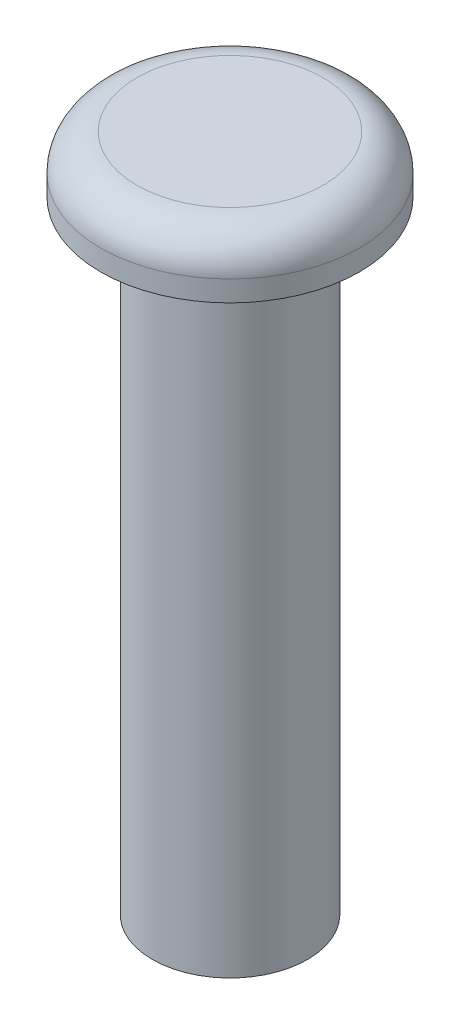
ISO-10303-21;
HEADER;
FILE_DESCRIPTION(('STEP AP214'),'2;1');
FILE_NAME('part.step','',(''),(''),'','','');
FILE_SCHEMA(('AUTOMOTIVE_DESIGN { 1 0 10303 214 1 1 1 1 }'));
ENDSEC;
DATA;
#1=APPLICATION_CONTEXT('core data for automotive mechanical design processes');
#2=APPLICATION_PROTOCOL_DEFINITION('international standard','automotive_design',2000,#1);
#3=PRODUCT_CONTEXT('',#1,'mechanical');
#4=PRODUCT('Part','Part','',(#3));
#5=PRODUCT_RELATED_PRODUCT_CATEGORY('part','',(#4));
#6=PRODUCT_DEFINITION_FORMATION('','',#4);
#7=PRODUCT_DEFINITION_CONTEXT('part definition',#1,'design');
#8=PRODUCT_DEFINITION('design','',#6,#7);
#9=PRODUCT_DEFINITION_SHAPE('','',#8);
#10=(LENGTH_UNIT() NAMED_UNIT(*) SI_UNIT(.MILLI.,.METRE.));
#11=(NAMED_UNIT(*) PLANE_ANGLE_UNIT() SI_UNIT($,.RADIAN.));
#12=(NAMED_UNIT(*) SI_UNIT($,.STERADIAN.) SOLID_ANGLE_UNIT());
#13=UNCERTAINTY_MEASURE_WITH_UNIT(LENGTH_MEASURE(1.E-05),#10,'distance_accuracy_value','');
#14=(GEOMETRIC_REPRESENTATION_CONTEXT(3) GLOBAL_UNCERTAINTY_ASSIGNED_CONTEXT((#13)) GLOBAL_UNIT_ASSIGNED_CONTEXT((#10,
#11,#12)) REPRESENTATION_CONTEXT('',''));
#15=CARTESIAN_POINT('',(0.,0.,0.));
#16=DIRECTION('',(0.,0.,1.));
#17=DIRECTION('',(1.,0.,0.));
#18=AXIS2_PLACEMENT_3D('',#15,#16,#17);
#19=CARTESIAN_POINT('',(0.,12.,0.));
#20=DIRECTION('',(0.,-1.,0.));
#21=DIRECTION('',(0.,0.,-1.));
#22=AXIS2_PLACEMENT_3D('',#19,#20,#21);
#23=CYLINDRICAL_SURFACE('',#22,1.5);
#24=CARTESIAN_POINT('',(0.,12.,0.));
#25=DIRECTION('',(0.,1.,0.));
#26=DIRECTION('',(0.,0.,1.));
#27=AXIS2_PLACEMENT_3D('',#24,#25,#26);
#28=CIRCLE('',#27,1.5);
#29=CARTESIAN_POINT('',(0.,12.,1.5));
#30=VERTEX_POINT('',#29);
#31=EDGE_CURVE('E44',#30,#30,#28,.T.);
#32=ORIENTED_EDGE('',*,*,#31,.F.);
#33=EDGE_LOOP('',(#32));
#34=FACE_BOUND('',#33,.T.);
#35=CARTESIAN_POINT('',(0.,0.,0.));
#36=DIRECTION('',(0.,1.,0.));
#37=DIRECTION('',(0.,0.,1.));
#38=AXIS2_PLACEMENT_3D('',#35,#36,#37);
#39=CIRCLE('',#38,1.5);
#40=CARTESIAN_POINT('',(0.,0.,1.5));
#41=VERTEX_POINT('',#40);
#42=EDGE_CURVE('E48',#41,#41,#39,.T.);
#43=ORIENTED_EDGE('',*,*,#42,.T.);
#44=EDGE_LOOP('',(#43));
#45=FACE_BOUND('',#44,.T.);
#46=ADVANCED_FACE('F33',(#34,#45),#23,.T.);
#47=CARTESIAN_POINT('',(0.,0.,0.));
#48=DIRECTION('',(0.,1.,0.));
#49=DIRECTION('',(0.,0.,1.));
#50=AXIS2_PLACEMENT_3D('',#47,#48,#49);
#51=PLANE('',#50);
#52=ORIENTED_EDGE('',*,*,#42,.F.);
#53=EDGE_LOOP('',(#52));
#54=FACE_BOUND('',#53,.T.);
#55=ADVANCED_FACE('F72',(#54),#51,.F.);
#56=CARTESIAN_POINT('',(0.,13.1,0.));
#57=DIRECTION('',(0.,-1.,0.));
#58=DIRECTION('',(0.,0.,-1.));
#59=AXIS2_PLACEMENT_3D('',#56,#57,#58);
#60=CYLINDRICAL_SURFACE('',#59,2.5);
#61=CARTESIAN_POINT('',(0.,12.4,0.));
#62=DIRECTION('',(0.,1.,0.));
#63=DIRECTION('',(0.,0.,1.));
#64=AXIS2_PLACEMENT_3D('',#61,#62,#63);
#65=CIRCLE('',#64,2.5);
#66=CARTESIAN_POINT('',(0.,12.4,2.5));
#67=VERTEX_POINT('',#66);
#68=EDGE_CURVE('E10',#67,#67,#65,.F.);
#69=ORIENTED_EDGE('',*,*,#68,.T.);
#70=EDGE_LOOP('',(#69));
#71=FACE_BOUND('',#70,.T.);
#72=CARTESIAN_POINT('',(0.,12.,0.));
#73=DIRECTION('',(0.,1.,0.));
#74=DIRECTION('',(0.,0.,1.));
#75=AXIS2_PLACEMENT_3D('',#72,#73,#74);
#76=CIRCLE('',#75,2.5);
#77=CARTESIAN_POINT('',(0.,12.,2.5));
#78=VERTEX_POINT('',#77);
#79=EDGE_CURVE('E52',#78,#78,#76,.T.);
#80=ORIENTED_EDGE('',*,*,#79,.T.);
#81=EDGE_LOOP('',(#80));
#82=FACE_BOUND('',#81,.T.);
#83=ADVANCED_FACE('F57',(#71,#82),#60,.T.);
#84=CARTESIAN_POINT('',(0.,13.1,0.));
#85=DIRECTION('',(0.,1.,0.));
#86=DIRECTION('',(0.,0.,1.));
#87=AXIS2_PLACEMENT_3D('',#84,#85,#86);
#88=PLANE('',#87);
#89=CARTESIAN_POINT('',(0.,13.1,0.));
#90=DIRECTION('',(0.,1.,0.));
#91=DIRECTION('',(0.,0.,1.));
#92=AXIS2_PLACEMENT_3D('',#89,#90,#91);
#93=CIRCLE('',#92,1.8);
#94=CARTESIAN_POINT('',(0.,13.1,1.8));
#95=VERTEX_POINT('',#94);
#96=EDGE_CURVE('E40',#95,#95,#93,.T.);
#97=ORIENTED_EDGE('',*,*,#96,.T.);
#98=EDGE_LOOP('',(#97));
#99=FACE_BOUND('',#98,.T.);
#100=ADVANCED_FACE('F61',(#99),#88,.T.);
#101=CARTESIAN_POINT('',(0.,12.,0.));
#102=DIRECTION('',(0.,1.,0.));
#103=DIRECTION('',(0.,0.,1.));
#104=AXIS2_PLACEMENT_3D('',#101,#102,#103);
#105=PLANE('',#104);
#106=ORIENTED_EDGE('',*,*,#31,.T.);
#107=EDGE_LOOP('',(#106));
#108=FACE_BOUND('',#107,.T.);
#109=ORIENTED_EDGE('',*,*,#79,.F.);
#110=EDGE_LOOP('',(#109));
#111=FACE_BOUND('',#110,.T.);
#112=ADVANCED_FACE('F59',(#108,#111),#105,.F.);
#113=CARTESIAN_POINT('',(0.,12.4,0.));
#114=DIRECTION('',(0.,1.,0.));
#115=DIRECTION('',(0.,0.,1.));
#116=AXIS2_PLACEMENT_3D('',#113,#114,#115);
#117=TOROIDAL_SURFACE('',#116,1.8,0.7);
#118=ORIENTED_EDGE('',*,*,#68,.F.);
#119=EDGE_LOOP('',(#118));
#120=FACE_BOUND('',#119,.T.);
#121=ORIENTED_EDGE('',*,*,#96,.F.);
#122=EDGE_LOOP('',(#121));
#123=FACE_BOUND('',#122,.T.);
#124=ADVANCED_FACE('F35',(#120,#123),#117,.T.);
#125=CLOSED_SHELL('',(#46,#55,#83,#100,#112,#124));
#126=MANIFOLD_SOLID_BREP('B2',#125);
#127=ADVANCED_BREP_SHAPE_REPRESENTATION('',(#18,#126),#14);
#128=SHAPE_DEFINITION_REPRESENTATION(#9,#127);
ENDSEC;
END-ISO-10303-21;
